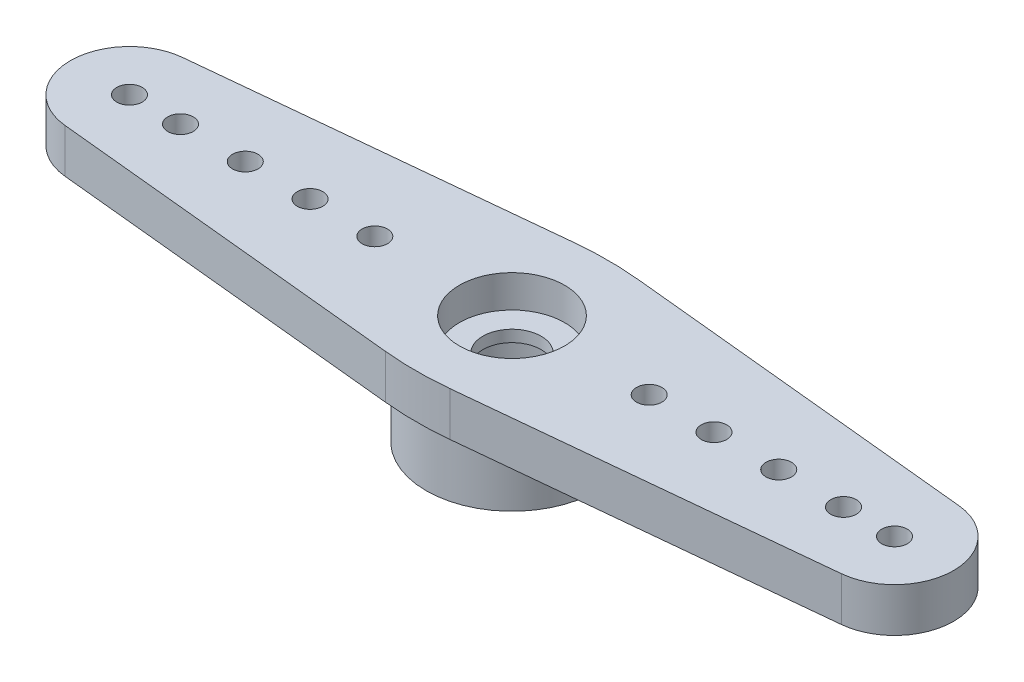
ISO-10303-21;
HEADER;
FILE_DESCRIPTION(('STEP AP214'),'2;1');
FILE_NAME('part.step','',(''),(''),'','','');
FILE_SCHEMA(('AUTOMOTIVE_DESIGN { 1 0 10303 214 1 1 1 1 }'));
ENDSEC;
DATA;
#1=APPLICATION_CONTEXT('core data for automotive mechanical design processes');
#2=APPLICATION_PROTOCOL_DEFINITION('international standard','automotive_design',2000,#1);
#3=PRODUCT_CONTEXT('',#1,'mechanical');
#4=PRODUCT('Part','Part','',(#3));
#5=PRODUCT_RELATED_PRODUCT_CATEGORY('part','',(#4));
#6=PRODUCT_DEFINITION_FORMATION('','',#4);
#7=PRODUCT_DEFINITION_CONTEXT('part definition',#1,'design');
#8=PRODUCT_DEFINITION('design','',#6,#7);
#9=PRODUCT_DEFINITION_SHAPE('','',#8);
#10=(LENGTH_UNIT() NAMED_UNIT(*) SI_UNIT(.MILLI.,.METRE.));
#11=(NAMED_UNIT(*) PLANE_ANGLE_UNIT() SI_UNIT($,.RADIAN.));
#12=(NAMED_UNIT(*) SI_UNIT($,.STERADIAN.) SOLID_ANGLE_UNIT());
#13=UNCERTAINTY_MEASURE_WITH_UNIT(LENGTH_MEASURE(1.E-05),#10,'distance_accuracy_value','');
#14=(GEOMETRIC_REPRESENTATION_CONTEXT(3) GLOBAL_UNCERTAINTY_ASSIGNED_CONTEXT((#13)) GLOBAL_UNIT_ASSIGNED_CONTEXT((#10,
#11,#12)) REPRESENTATION_CONTEXT('',''));
#15=CARTESIAN_POINT('',(0.,0.,0.));
#16=DIRECTION('',(0.,0.,1.));
#17=DIRECTION('',(1.,0.,0.));
#18=AXIS2_PLACEMENT_3D('',#15,#16,#17);
#19=CARTESIAN_POINT('',(0.,4.2672,0.));
#20=DIRECTION('',(0.,-1.,0.));
#21=DIRECTION('',(0.,0.,-1.));
#22=AXIS2_PLACEMENT_3D('',#19,#20,#21);
#23=CYLINDRICAL_SURFACE('',#22,1.143);
#24=CARTESIAN_POINT('',(0.,2.54,0.));
#25=DIRECTION('',(0.,1.,0.));
#26=DIRECTION('',(0.,0.,1.));
#27=AXIS2_PLACEMENT_3D('',#24,#25,#26);
#28=CIRCLE('',#27,1.143);
#29=CARTESIAN_POINT('',(0.,2.54,1.143));
#30=VERTEX_POINT('',#29);
#31=EDGE_CURVE('E124',#30,#30,#28,.T.);
#32=ORIENTED_EDGE('',*,*,#31,.F.);
#33=EDGE_LOOP('',(#32));
#34=FACE_BOUND('',#33,.T.);
#35=CARTESIAN_POINT('',(0.,2.9972,0.));
#36=DIRECTION('',(0.,1.,0.));
#37=DIRECTION('',(0.,0.,1.));
#38=AXIS2_PLACEMENT_3D('',#35,#36,#37);
#39=CIRCLE('',#38,1.143);
#40=CARTESIAN_POINT('',(0.,2.9972,1.143));
#41=VERTEX_POINT('',#40);
#42=EDGE_CURVE('E464',#41,#41,#39,.F.);
#43=ORIENTED_EDGE('',*,*,#42,.F.);
#44=EDGE_LOOP('',(#43));
#45=FACE_BOUND('',#44,.T.);
#46=ADVANCED_FACE('F35',(#34,#45),#23,.F.);
#47=CARTESIAN_POINT('',(0.,0.,0.));
#48=DIRECTION('',(0.,1.,0.));
#49=DIRECTION('',(0.,0.,1.));
#50=AXIS2_PLACEMENT_3D('',#47,#48,#49);
#51=PLANE('',#50);
#52=CARTESIAN_POINT('',(0.,0.,0.));
#53=DIRECTION('',(0.,1.,0.));
#54=DIRECTION('',(0.,0.,1.));
#55=AXIS2_PLACEMENT_3D('',#52,#53,#54);
#56=CIRCLE('',#55,3.3655);
#57=CARTESIAN_POINT('',(0.,0.,3.3655));
#58=VERTEX_POINT('',#57);
#59=EDGE_CURVE('E219',#58,#58,#56,.T.);
#60=ORIENTED_EDGE('',*,*,#59,.F.);
#61=EDGE_LOOP('',(#60));
#62=FACE_BOUND('',#61,.T.);
#63=CARTESIAN_POINT('',(0.,0.,0.));
#64=DIRECTION('',(0.,1.,0.));
#65=DIRECTION('',(0.,0.,1.));
#66=AXIS2_PLACEMENT_3D('',#63,#64,#65);
#67=CIRCLE('',#66,2.5);
#68=CARTESIAN_POINT('',(0.,0.,2.5));
#69=VERTEX_POINT('',#68);
#70=EDGE_CURVE('E216',#69,#69,#67,.T.);
#71=ORIENTED_EDGE('',*,*,#70,.T.);
#72=EDGE_LOOP('',(#71));
#73=FACE_BOUND('',#72,.T.);
#74=ADVANCED_FACE('F271',(#62,#73),#51,.F.);
#75=CARTESIAN_POINT('',(0.,2.54,0.));
#76=DIRECTION('',(0.,-1.,0.));
#77=DIRECTION('',(0.,0.,-1.));
#78=AXIS2_PLACEMENT_3D('',#75,#76,#77);
#79=CYLINDRICAL_SURFACE('',#78,3.3655);
#80=CARTESIAN_POINT('',(0.,2.54,0.));
#81=DIRECTION('',(0.,1.,0.));
#82=DIRECTION('',(0.,0.,1.));
#83=AXIS2_PLACEMENT_3D('',#80,#81,#82);
#84=CIRCLE('',#83,3.3655);
#85=CARTESIAN_POINT('',(0.,2.54,3.3655));
#86=VERTEX_POINT('',#85);
#87=EDGE_CURVE('E220',#86,#86,#84,.T.);
#88=ORIENTED_EDGE('',*,*,#87,.F.);
#89=EDGE_LOOP('',(#88));
#90=FACE_BOUND('',#89,.T.);
#91=ORIENTED_EDGE('',*,*,#59,.T.);
#92=EDGE_LOOP('',(#91));
#93=FACE_BOUND('',#92,.T.);
#94=ADVANCED_FACE('F277',(#90,#93),#79,.T.);
#95=CARTESIAN_POINT('',(0.,2.54,0.));
#96=DIRECTION('',(0.,-1.,0.));
#97=DIRECTION('',(0.,0.,-1.));
#98=AXIS2_PLACEMENT_3D('',#95,#96,#97);
#99=CYLINDRICAL_SURFACE('',#98,2.5);
#100=CARTESIAN_POINT('',(0.,2.54,0.));
#101=DIRECTION('',(0.,1.,0.));
#102=DIRECTION('',(0.,0.,1.));
#103=AXIS2_PLACEMENT_3D('',#100,#101,#102);
#104=CIRCLE('',#103,2.5);
#105=CARTESIAN_POINT('',(0.,2.54,2.5));
#106=VERTEX_POINT('',#105);
#107=EDGE_CURVE('E112',#106,#106,#104,.T.);
#108=ORIENTED_EDGE('',*,*,#107,.T.);
#109=EDGE_LOOP('',(#108));
#110=FACE_BOUND('',#109,.T.);
#111=ORIENTED_EDGE('',*,*,#70,.F.);
#112=EDGE_LOOP('',(#111));
#113=FACE_BOUND('',#112,.T.);
#114=ADVANCED_FACE('F339',(#110,#113),#99,.F.);
#115=CARTESIAN_POINT('',(0.,2.54,0.));
#116=DIRECTION('',(0.,1.,0.));
#117=DIRECTION('',(0.,0.,1.));
#118=AXIS2_PLACEMENT_3D('',#115,#116,#117);
#119=PLANE('',#118);
#120=ORIENTED_EDGE('',*,*,#31,.T.);
#121=EDGE_LOOP('',(#120));
#122=FACE_BOUND('',#121,.T.);
#123=ORIENTED_EDGE('',*,*,#107,.F.);
#124=EDGE_LOOP('',(#123));
#125=FACE_BOUND('',#124,.T.);
#126=ADVANCED_FACE('F335',(#122,#125),#119,.F.);
#127=CARTESIAN_POINT('',(-15.,4.2672,0.));
#128=DIRECTION('',(0.,-1.,0.));
#129=DIRECTION('',(0.,0.,-1.));
#130=AXIS2_PLACEMENT_3D('',#127,#128,#129);
#131=CYLINDRICAL_SURFACE('',#130,2.31775);
#132=CARTESIAN_POINT('',(-15.,2.54,0.));
#133=DIRECTION('',(0.,1.,0.));
#134=DIRECTION('',(0.,0.,1.));
#135=AXIS2_PLACEMENT_3D('',#132,#133,#134);
#136=CIRCLE('',#135,2.31775);
#137=CARTESIAN_POINT('',(-15.2296336726967,2.54,2.30634633974688));
#138=VERTEX_POINT('',#137);
#139=CARTESIAN_POINT('',(-15.2296336726967,2.54,-2.30634633974688));
#140=VERTEX_POINT('',#139);
#141=EDGE_CURVE('E111',#138,#140,#136,.F.);
#142=ORIENTED_EDGE('',*,*,#141,.F.);
#143=DIRECTION('',(0.,-1.,0.));
#144=VECTOR('',#143,1.);
#145=CARTESIAN_POINT('',(-15.2296336726967,4.2672,2.30634633974688));
#146=LINE('',#145,#144);
#147=CARTESIAN_POINT('',(-15.2296336726967,4.2672,2.30634633974688));
#148=VERTEX_POINT('',#147);
#149=EDGE_CURVE('E100',#148,#138,#146,.T.);
#150=ORIENTED_EDGE('',*,*,#149,.F.);
#151=CARTESIAN_POINT('',(-15.,4.2672,0.));
#152=DIRECTION('',(0.,1.,0.));
#153=DIRECTION('',(0.,0.,1.));
#154=AXIS2_PLACEMENT_3D('',#151,#152,#153);
#155=CIRCLE('',#154,2.31775);
#156=CARTESIAN_POINT('',(-15.2296336726967,4.2672,-2.30634633974688));
#157=VERTEX_POINT('',#156);
#158=EDGE_CURVE('E104',#148,#157,#155,.F.);
#159=ORIENTED_EDGE('',*,*,#158,.T.);
#160=DIRECTION('',(0.,-1.,0.));
#161=VECTOR('',#160,1.);
#162=CARTESIAN_POINT('',(-15.2296336726967,4.2672,-2.30634633974688));
#163=LINE('',#162,#161);
#164=EDGE_CURVE('E162',#157,#140,#163,.T.);
#165=ORIENTED_EDGE('',*,*,#164,.T.);
#166=EDGE_LOOP('',(#142,#150,#159,#165));
#167=FACE_BOUND('',#166,.T.);
#168=ADVANCED_FACE('F108',(#167),#131,.T.);
#169=CARTESIAN_POINT('',(-0.376874830325234,4.2672,3.78517608178222));
#170=DIRECTION('',(-0.0990761180872368,0.,0.995079857511328));
#171=DIRECTION('',(0.995079857511328,0.,0.0990761180872368));
#172=AXIS2_PLACEMENT_3D('',#169,#170,#171);
#173=PLANE('',#172);
#174=DIRECTION('',(-0.995079857511328,0.,-0.0990761180872368));
#175=VECTOR('',#174,1.);
#176=CARTESIAN_POINT('',(-0.376874830325234,2.54,3.78517608178222));
#177=LINE('',#176,#175);
#178=CARTESIAN_POINT('',(-1.25826669970791,2.54,3.6974194215776));
#179=VERTEX_POINT('',#178);
#180=EDGE_CURVE('E168',#179,#138,#177,.T.);
#181=ORIENTED_EDGE('',*,*,#180,.F.);
#182=DIRECTION('',(0.,-1.,0.));
#183=VECTOR('',#182,1.);
#184=CARTESIAN_POINT('',(-1.25826669970791,4.2672,3.6974194215776));
#185=LINE('',#184,#183);
#186=CARTESIAN_POINT('',(-1.25826669970791,4.2672,3.6974194215776));
#187=VERTEX_POINT('',#186);
#188=EDGE_CURVE('E11',#179,#187,#185,.F.);
#189=ORIENTED_EDGE('',*,*,#188,.T.);
#190=DIRECTION('',(-0.995079857511328,0.,-0.0990761180872368));
#191=VECTOR('',#190,1.);
#192=CARTESIAN_POINT('',(-0.376874830325234,4.2672,3.78517608178222));
#193=LINE('',#192,#191);
#194=EDGE_CURVE('E97',#187,#148,#193,.T.);
#195=ORIENTED_EDGE('',*,*,#194,.T.);
#196=ORIENTED_EDGE('',*,*,#149,.T.);
#197=EDGE_LOOP('',(#181,#189,#195,#196));
#198=FACE_BOUND('',#197,.T.);
#199=ADVANCED_FACE('F99',(#198),#173,.T.);
#200=CARTESIAN_POINT('',(0.376874830325234,4.2672,3.78517608178222));
#201=DIRECTION('',(-0.0990761180872368,0.,-0.995079857511328));
#202=DIRECTION('',(-0.995079857511328,0.,0.0990761180872368));
#203=AXIS2_PLACEMENT_3D('',#200,#201,#202);
#204=PLANE('',#203);
#205=DIRECTION('',(0.995079857511328,0.,-0.0990761180872368));
#206=VECTOR('',#205,1.);
#207=CARTESIAN_POINT('',(0.376874830325234,4.2672,3.78517608178222));
#208=LINE('',#207,#206);
#209=CARTESIAN_POINT('',(1.25826669970791,4.2672,3.6974194215776));
#210=VERTEX_POINT('',#209);
#211=CARTESIAN_POINT('',(15.2296336726967,4.2672,2.30634633974688));
#212=VERTEX_POINT('',#211);
#213=EDGE_CURVE('E103',#210,#212,#208,.T.);
#214=ORIENTED_EDGE('',*,*,#213,.F.);
#215=DIRECTION('',(0.,-1.,0.));
#216=VECTOR('',#215,1.);
#217=CARTESIAN_POINT('',(1.25826669970791,2.54,3.6974194215776));
#218=LINE('',#217,#216);
#219=CARTESIAN_POINT('',(1.25826669970791,2.54,3.6974194215776));
#220=VERTEX_POINT('',#219);
#221=EDGE_CURVE('E43',#210,#220,#218,.T.);
#222=ORIENTED_EDGE('',*,*,#221,.T.);
#223=DIRECTION('',(0.995079857511328,0.,-0.0990761180872368));
#224=VECTOR('',#223,1.);
#225=CARTESIAN_POINT('',(0.376874830325234,2.54,3.78517608178222));
#226=LINE('',#225,#224);
#227=CARTESIAN_POINT('',(15.2296336726967,2.54,2.30634633974688));
#228=VERTEX_POINT('',#227);
#229=EDGE_CURVE('E170',#220,#228,#226,.T.);
#230=ORIENTED_EDGE('',*,*,#229,.T.);
#231=DIRECTION('',(0.,-1.,0.));
#232=VECTOR('',#231,1.);
#233=CARTESIAN_POINT('',(15.2296336726967,4.2672,2.30634633974688));
#234=LINE('',#233,#232);
#235=EDGE_CURVE('E113',#212,#228,#234,.T.);
#236=ORIENTED_EDGE('',*,*,#235,.F.);
#237=EDGE_LOOP('',(#214,#222,#230,#236));
#238=FACE_BOUND('',#237,.T.);
#239=ADVANCED_FACE('F240',(#238),#204,.F.);
#240=CARTESIAN_POINT('',(15.,4.2672,0.));
#241=DIRECTION('',(0.,-1.,0.));
#242=DIRECTION('',(0.,0.,-1.));
#243=AXIS2_PLACEMENT_3D('',#240,#241,#242);
#244=CYLINDRICAL_SURFACE('',#243,2.31775);
#245=CARTESIAN_POINT('',(15.,2.54,0.));
#246=DIRECTION('',(0.,1.,0.));
#247=DIRECTION('',(0.,0.,1.));
#248=AXIS2_PLACEMENT_3D('',#245,#246,#247);
#249=CIRCLE('',#248,2.31775);
#250=CARTESIAN_POINT('',(15.2296336726967,2.54,-2.30634633974688));
#251=VERTEX_POINT('',#250);
#252=EDGE_CURVE('E172',#228,#251,#249,.T.);
#253=ORIENTED_EDGE('',*,*,#252,.T.);
#254=DIRECTION('',(0.,-1.,0.));
#255=VECTOR('',#254,1.);
#256=CARTESIAN_POINT('',(15.2296336726967,4.2672,-2.30634633974688));
#257=LINE('',#256,#255);
#258=CARTESIAN_POINT('',(15.2296336726967,4.2672,-2.30634633974688));
#259=VERTEX_POINT('',#258);
#260=EDGE_CURVE('E209',#259,#251,#257,.T.);
#261=ORIENTED_EDGE('',*,*,#260,.F.);
#262=CARTESIAN_POINT('',(15.,4.2672,0.));
#263=DIRECTION('',(0.,1.,0.));
#264=DIRECTION('',(0.,0.,1.));
#265=AXIS2_PLACEMENT_3D('',#262,#263,#264);
#266=CIRCLE('',#265,2.31775);
#267=EDGE_CURVE('E129',#212,#259,#266,.T.);
#268=ORIENTED_EDGE('',*,*,#267,.F.);
#269=ORIENTED_EDGE('',*,*,#235,.T.);
#270=EDGE_LOOP('',(#253,#261,#268,#269));
#271=FACE_BOUND('',#270,.T.);
#272=ADVANCED_FACE('F252',(#271),#244,.T.);
#273=CARTESIAN_POINT('',(0.376874830325234,4.2672,-3.78517608178222));
#274=DIRECTION('',(0.0990761180872368,0.,-0.995079857511328));
#275=DIRECTION('',(-0.995079857511328,0.,-0.0990761180872368));
#276=AXIS2_PLACEMENT_3D('',#273,#274,#275);
#277=PLANE('',#276);
#278=DIRECTION('',(0.995079857511328,0.,0.0990761180872368));
#279=VECTOR('',#278,1.);
#280=CARTESIAN_POINT('',(0.376874830325234,2.54,-3.78517608178222));
#281=LINE('',#280,#279);
#282=CARTESIAN_POINT('',(1.25826669970791,2.54,-3.6974194215776));
#283=VERTEX_POINT('',#282);
#284=EDGE_CURVE('E175',#283,#251,#281,.T.);
#285=ORIENTED_EDGE('',*,*,#284,.F.);
#286=DIRECTION('',(0.,-1.,0.));
#287=VECTOR('',#286,1.);
#288=CARTESIAN_POINT('',(1.25826669970791,4.2672,-3.6974194215776));
#289=LINE('',#288,#287);
#290=CARTESIAN_POINT('',(1.25826669970791,4.2672,-3.6974194215776));
#291=VERTEX_POINT('',#290);
#292=EDGE_CURVE('E232',#283,#291,#289,.F.);
#293=ORIENTED_EDGE('',*,*,#292,.T.);
#294=DIRECTION('',(0.995079857511328,0.,0.0990761180872368));
#295=VECTOR('',#294,1.);
#296=CARTESIAN_POINT('',(0.376874830325234,4.2672,-3.78517608178222));
#297=LINE('',#296,#295);
#298=EDGE_CURVE('E132',#291,#259,#297,.T.);
#299=ORIENTED_EDGE('',*,*,#298,.T.);
#300=ORIENTED_EDGE('',*,*,#260,.T.);
#301=EDGE_LOOP('',(#285,#293,#299,#300));
#302=FACE_BOUND('',#301,.T.);
#303=ADVANCED_FACE('F289',(#302),#277,.T.);
#304=CARTESIAN_POINT('',(15.,4.2672,0.));
#305=DIRECTION('',(0.,-1.,0.));
#306=DIRECTION('',(0.,0.,-1.));
#307=AXIS2_PLACEMENT_3D('',#304,#305,#306);
#308=CYLINDRICAL_SURFACE('',#307,0.500000000000001);
#309=CARTESIAN_POINT('',(15.,4.2672,0.));
#310=DIRECTION('',(0.,1.,0.));
#311=DIRECTION('',(0.,0.,1.));
#312=AXIS2_PLACEMENT_3D('',#309,#310,#311);
#313=CIRCLE('',#312,0.500000000000001);
#314=CARTESIAN_POINT('',(15.,4.2672,0.500000000000001));
#315=VERTEX_POINT('',#314);
#316=EDGE_CURVE('E159',#315,#315,#313,.T.);
#317=ORIENTED_EDGE('',*,*,#316,.T.);
#318=EDGE_LOOP('',(#317));
#319=FACE_BOUND('',#318,.T.);
#320=CARTESIAN_POINT('',(15.,2.54,0.));
#321=DIRECTION('',(0.,1.,0.));
#322=DIRECTION('',(0.,0.,1.));
#323=AXIS2_PLACEMENT_3D('',#320,#321,#322);
#324=CIRCLE('',#323,0.500000000000001);
#325=CARTESIAN_POINT('',(15.,2.54,0.500000000000001));
#326=VERTEX_POINT('',#325);
#327=EDGE_CURVE('E203',#326,#326,#324,.T.);
#328=ORIENTED_EDGE('',*,*,#327,.F.);
#329=EDGE_LOOP('',(#328));
#330=FACE_BOUND('',#329,.T.);
#331=ADVANCED_FACE('F285',(#319,#330),#308,.F.);
#332=CARTESIAN_POINT('',(5.38,4.2672,0.));
#333=DIRECTION('',(0.,-1.,0.));
#334=DIRECTION('',(0.,0.,-1.));
#335=AXIS2_PLACEMENT_3D('',#332,#333,#334);
#336=CYLINDRICAL_SURFACE('',#335,0.500000000000001);
#337=CARTESIAN_POINT('',(5.38,4.2672,0.));
#338=DIRECTION('',(0.,1.,0.));
#339=DIRECTION('',(0.,0.,1.));
#340=AXIS2_PLACEMENT_3D('',#337,#338,#339);
#341=CIRCLE('',#340,0.500000000000001);
#342=CARTESIAN_POINT('',(5.38,4.2672,0.500000000000001));
#343=VERTEX_POINT('',#342);
#344=EDGE_CURVE('E156',#343,#343,#341,.T.);
#345=ORIENTED_EDGE('',*,*,#344,.T.);
#346=EDGE_LOOP('',(#345));
#347=FACE_BOUND('',#346,.T.);
#348=CARTESIAN_POINT('',(5.38,2.54,0.));
#349=DIRECTION('',(0.,1.,0.));
#350=DIRECTION('',(0.,0.,1.));
#351=AXIS2_PLACEMENT_3D('',#348,#349,#350);
#352=CIRCLE('',#351,0.500000000000001);
#353=CARTESIAN_POINT('',(5.38,2.54,0.500000000000001));
#354=VERTEX_POINT('',#353);
#355=EDGE_CURVE('E200',#354,#354,#352,.T.);
#356=ORIENTED_EDGE('',*,*,#355,.F.);
#357=EDGE_LOOP('',(#356));
#358=FACE_BOUND('',#357,.T.);
#359=ADVANCED_FACE('F288',(#347,#358),#336,.F.);
#360=CARTESIAN_POINT('',(7.92,4.2672,0.));
#361=DIRECTION('',(0.,-1.,0.));
#362=DIRECTION('',(0.,0.,-1.));
#363=AXIS2_PLACEMENT_3D('',#360,#361,#362);
#364=CYLINDRICAL_SURFACE('',#363,0.500000000000002);
#365=CARTESIAN_POINT('',(7.92,4.2672,0.));
#366=DIRECTION('',(0.,1.,0.));
#367=DIRECTION('',(0.,0.,1.));
#368=AXIS2_PLACEMENT_3D('',#365,#366,#367);
#369=CIRCLE('',#368,0.500000000000002);
#370=CARTESIAN_POINT('',(7.92,4.2672,0.500000000000002));
#371=VERTEX_POINT('',#370);
#372=EDGE_CURVE('E153',#371,#371,#369,.T.);
#373=ORIENTED_EDGE('',*,*,#372,.T.);
#374=EDGE_LOOP('',(#373));
#375=FACE_BOUND('',#374,.T.);
#376=CARTESIAN_POINT('',(7.92,2.54,0.));
#377=DIRECTION('',(0.,1.,0.));
#378=DIRECTION('',(0.,0.,1.));
#379=AXIS2_PLACEMENT_3D('',#376,#377,#378);
#380=CIRCLE('',#379,0.500000000000002);
#381=CARTESIAN_POINT('',(7.92,2.54,0.500000000000002));
#382=VERTEX_POINT('',#381);
#383=EDGE_CURVE('E197',#382,#382,#380,.T.);
#384=ORIENTED_EDGE('',*,*,#383,.F.);
#385=EDGE_LOOP('',(#384));
#386=FACE_BOUND('',#385,.T.);
#387=ADVANCED_FACE('F293',(#375,#386),#364,.F.);
#388=CARTESIAN_POINT('',(10.46,4.2672,0.));
#389=DIRECTION('',(0.,-1.,0.));
#390=DIRECTION('',(0.,0.,-1.));
#391=AXIS2_PLACEMENT_3D('',#388,#389,#390);
#392=CYLINDRICAL_SURFACE('',#391,0.500000000000001);
#393=CARTESIAN_POINT('',(10.46,4.2672,0.));
#394=DIRECTION('',(0.,1.,0.));
#395=DIRECTION('',(0.,0.,1.));
#396=AXIS2_PLACEMENT_3D('',#393,#394,#395);
#397=CIRCLE('',#396,0.500000000000001);
#398=CARTESIAN_POINT('',(10.46,4.2672,0.500000000000001));
#399=VERTEX_POINT('',#398);
#400=EDGE_CURVE('E150',#399,#399,#397,.T.);
#401=ORIENTED_EDGE('',*,*,#400,.T.);
#402=EDGE_LOOP('',(#401));
#403=FACE_BOUND('',#402,.T.);
#404=CARTESIAN_POINT('',(10.46,2.54,0.));
#405=DIRECTION('',(0.,1.,0.));
#406=DIRECTION('',(0.,0.,1.));
#407=AXIS2_PLACEMENT_3D('',#404,#405,#406);
#408=CIRCLE('',#407,0.500000000000001);
#409=CARTESIAN_POINT('',(10.46,2.54,0.500000000000001));
#410=VERTEX_POINT('',#409);
#411=EDGE_CURVE('E194',#410,#410,#408,.T.);
#412=ORIENTED_EDGE('',*,*,#411,.F.);
#413=EDGE_LOOP('',(#412));
#414=FACE_BOUND('',#413,.T.);
#415=ADVANCED_FACE('F297',(#403,#414),#392,.F.);
#416=CARTESIAN_POINT('',(13.,4.2672,0.));
#417=DIRECTION('',(0.,-1.,0.));
#418=DIRECTION('',(0.,0.,-1.));
#419=AXIS2_PLACEMENT_3D('',#416,#417,#418);
#420=CYLINDRICAL_SURFACE('',#419,0.500000000000001);
#421=CARTESIAN_POINT('',(13.,4.2672,0.));
#422=DIRECTION('',(0.,1.,0.));
#423=DIRECTION('',(0.,0.,1.));
#424=AXIS2_PLACEMENT_3D('',#421,#422,#423);
#425=CIRCLE('',#424,0.500000000000001);
#426=CARTESIAN_POINT('',(13.,4.2672,0.500000000000001));
#427=VERTEX_POINT('',#426);
#428=EDGE_CURVE('E147',#427,#427,#425,.T.);
#429=ORIENTED_EDGE('',*,*,#428,.T.);
#430=EDGE_LOOP('',(#429));
#431=FACE_BOUND('',#430,.T.);
#432=CARTESIAN_POINT('',(13.,2.54,0.));
#433=DIRECTION('',(0.,1.,0.));
#434=DIRECTION('',(0.,0.,1.));
#435=AXIS2_PLACEMENT_3D('',#432,#433,#434);
#436=CIRCLE('',#435,0.500000000000001);
#437=CARTESIAN_POINT('',(13.,2.54,0.500000000000001));
#438=VERTEX_POINT('',#437);
#439=EDGE_CURVE('E191',#438,#438,#436,.T.);
#440=ORIENTED_EDGE('',*,*,#439,.F.);
#441=EDGE_LOOP('',(#440));
#442=FACE_BOUND('',#441,.T.);
#443=ADVANCED_FACE('F301',(#431,#442),#420,.F.);
#444=CARTESIAN_POINT('',(-15.,4.2672,0.));
#445=DIRECTION('',(0.,-1.,0.));
#446=DIRECTION('',(0.,0.,-1.));
#447=AXIS2_PLACEMENT_3D('',#444,#445,#446);
#448=CYLINDRICAL_SURFACE('',#447,0.500000000000001);
#449=CARTESIAN_POINT('',(-15.,4.2672,0.));
#450=DIRECTION('',(0.,1.,0.));
#451=DIRECTION('',(0.,0.,1.));
#452=AXIS2_PLACEMENT_3D('',#449,#450,#451);
#453=CIRCLE('',#452,0.500000000000001);
#454=CARTESIAN_POINT('',(-15.,4.2672,0.500000000000001));
#455=VERTEX_POINT('',#454);
#456=EDGE_CURVE('E144',#455,#455,#453,.F.);
#457=ORIENTED_EDGE('',*,*,#456,.F.);
#458=EDGE_LOOP('',(#457));
#459=FACE_BOUND('',#458,.T.);
#460=CARTESIAN_POINT('',(-15.,2.54,0.));
#461=DIRECTION('',(0.,1.,0.));
#462=DIRECTION('',(0.,0.,1.));
#463=AXIS2_PLACEMENT_3D('',#460,#461,#462);
#464=CIRCLE('',#463,0.500000000000001);
#465=CARTESIAN_POINT('',(-15.,2.54,0.500000000000001));
#466=VERTEX_POINT('',#465);
#467=EDGE_CURVE('E188',#466,#466,#464,.F.);
#468=ORIENTED_EDGE('',*,*,#467,.T.);
#469=EDGE_LOOP('',(#468));
#470=FACE_BOUND('',#469,.T.);
#471=ADVANCED_FACE('F305',(#459,#470),#448,.F.);
#472=CARTESIAN_POINT('',(-5.38,4.2672,0.));
#473=DIRECTION('',(0.,-1.,0.));
#474=DIRECTION('',(0.,0.,-1.));
#475=AXIS2_PLACEMENT_3D('',#472,#473,#474);
#476=CYLINDRICAL_SURFACE('',#475,0.500000000000001);
#477=CARTESIAN_POINT('',(-5.38,4.2672,0.));
#478=DIRECTION('',(0.,1.,0.));
#479=DIRECTION('',(0.,0.,1.));
#480=AXIS2_PLACEMENT_3D('',#477,#478,#479);
#481=CIRCLE('',#480,0.500000000000001);
#482=CARTESIAN_POINT('',(-5.38,4.2672,0.500000000000001));
#483=VERTEX_POINT('',#482);
#484=EDGE_CURVE('E141',#483,#483,#481,.F.);
#485=ORIENTED_EDGE('',*,*,#484,.F.);
#486=EDGE_LOOP('',(#485));
#487=FACE_BOUND('',#486,.T.);
#488=CARTESIAN_POINT('',(-5.38,2.54,0.));
#489=DIRECTION('',(0.,1.,0.));
#490=DIRECTION('',(0.,0.,1.));
#491=AXIS2_PLACEMENT_3D('',#488,#489,#490);
#492=CIRCLE('',#491,0.500000000000001);
#493=CARTESIAN_POINT('',(-5.38,2.54,0.500000000000001));
#494=VERTEX_POINT('',#493);
#495=EDGE_CURVE('E185',#494,#494,#492,.F.);
#496=ORIENTED_EDGE('',*,*,#495,.T.);
#497=EDGE_LOOP('',(#496));
#498=FACE_BOUND('',#497,.T.);
#499=ADVANCED_FACE('F309',(#487,#498),#476,.F.);
#500=CARTESIAN_POINT('',(-10.46,4.2672,0.));
#501=DIRECTION('',(0.,-1.,0.));
#502=DIRECTION('',(0.,0.,-1.));
#503=AXIS2_PLACEMENT_3D('',#500,#501,#502);
#504=CYLINDRICAL_SURFACE('',#503,0.500000000000001);
#505=CARTESIAN_POINT('',(-10.46,4.2672,0.));
#506=DIRECTION('',(0.,1.,0.));
#507=DIRECTION('',(0.,0.,1.));
#508=AXIS2_PLACEMENT_3D('',#505,#506,#507);
#509=CIRCLE('',#508,0.500000000000001);
#510=CARTESIAN_POINT('',(-10.46,4.2672,0.500000000000001));
#511=VERTEX_POINT('',#510);
#512=EDGE_CURVE('E138',#511,#511,#509,.F.);
#513=ORIENTED_EDGE('',*,*,#512,.F.);
#514=EDGE_LOOP('',(#513));
#515=FACE_BOUND('',#514,.T.);
#516=CARTESIAN_POINT('',(-10.46,2.54,0.));
#517=DIRECTION('',(0.,1.,0.));
#518=DIRECTION('',(0.,0.,1.));
#519=AXIS2_PLACEMENT_3D('',#516,#517,#518);
#520=CIRCLE('',#519,0.500000000000001);
#521=CARTESIAN_POINT('',(-10.46,2.54,0.500000000000001));
#522=VERTEX_POINT('',#521);
#523=EDGE_CURVE('E182',#522,#522,#520,.F.);
#524=ORIENTED_EDGE('',*,*,#523,.T.);
#525=EDGE_LOOP('',(#524));
#526=FACE_BOUND('',#525,.T.);
#527=ADVANCED_FACE('F313',(#515,#526),#504,.F.);
#528=CARTESIAN_POINT('',(-7.92,4.2672,0.));
#529=DIRECTION('',(0.,-1.,0.));
#530=DIRECTION('',(0.,0.,-1.));
#531=AXIS2_PLACEMENT_3D('',#528,#529,#530);
#532=CYLINDRICAL_SURFACE('',#531,0.500000000000002);
#533=CARTESIAN_POINT('',(-7.92,4.2672,0.));
#534=DIRECTION('',(0.,1.,0.));
#535=DIRECTION('',(0.,0.,1.));
#536=AXIS2_PLACEMENT_3D('',#533,#534,#535);
#537=CIRCLE('',#536,0.500000000000002);
#538=CARTESIAN_POINT('',(-7.92,4.2672,0.500000000000002));
#539=VERTEX_POINT('',#538);
#540=EDGE_CURVE('E135',#539,#539,#537,.F.);
#541=ORIENTED_EDGE('',*,*,#540,.F.);
#542=EDGE_LOOP('',(#541));
#543=FACE_BOUND('',#542,.T.);
#544=CARTESIAN_POINT('',(-7.92,2.54,0.));
#545=DIRECTION('',(0.,1.,0.));
#546=DIRECTION('',(0.,0.,1.));
#547=AXIS2_PLACEMENT_3D('',#544,#545,#546);
#548=CIRCLE('',#547,0.500000000000002);
#549=CARTESIAN_POINT('',(-7.92,2.54,0.500000000000002));
#550=VERTEX_POINT('',#549);
#551=EDGE_CURVE('E179',#550,#550,#548,.F.);
#552=ORIENTED_EDGE('',*,*,#551,.T.);
#553=EDGE_LOOP('',(#552));
#554=FACE_BOUND('',#553,.T.);
#555=ADVANCED_FACE('F317',(#543,#554),#532,.F.);
#556=CARTESIAN_POINT('',(-0.376874830325234,4.2672,-3.78517608178222));
#557=DIRECTION('',(0.0990761180872368,0.,0.995079857511328));
#558=DIRECTION('',(0.995079857511328,0.,-0.0990761180872368));
#559=AXIS2_PLACEMENT_3D('',#556,#557,#558);
#560=PLANE('',#559);
#561=DIRECTION('',(-0.995079857511328,0.,0.0990761180872368));
#562=VECTOR('',#561,1.);
#563=CARTESIAN_POINT('',(-0.376874830325234,4.2672,-3.78517608178222));
#564=LINE('',#563,#562);
#565=CARTESIAN_POINT('',(-1.25826669970791,4.2672,-3.6974194215776));
#566=VERTEX_POINT('',#565);
#567=EDGE_CURVE('E119',#566,#157,#564,.T.);
#568=ORIENTED_EDGE('',*,*,#567,.F.);
#569=DIRECTION('',(0.,-1.,0.));
#570=VECTOR('',#569,1.);
#571=CARTESIAN_POINT('',(-1.25826669970791,2.54,-3.6974194215776));
#572=LINE('',#571,#570);
#573=CARTESIAN_POINT('',(-1.25826669970791,2.54,-3.6974194215776));
#574=VERTEX_POINT('',#573);
#575=EDGE_CURVE('E223',#566,#574,#572,.T.);
#576=ORIENTED_EDGE('',*,*,#575,.T.);
#577=DIRECTION('',(-0.995079857511328,0.,0.0990761180872368));
#578=VECTOR('',#577,1.);
#579=CARTESIAN_POINT('',(-0.376874830325234,2.54,-3.78517608178222));
#580=LINE('',#579,#578);
#581=EDGE_CURVE('E177',#574,#140,#580,.T.);
#582=ORIENTED_EDGE('',*,*,#581,.T.);
#583=ORIENTED_EDGE('',*,*,#164,.F.);
#584=EDGE_LOOP('',(#568,#576,#582,#583));
#585=FACE_BOUND('',#584,.T.);
#586=ADVANCED_FACE('F260',(#585),#560,.F.);
#587=CARTESIAN_POINT('',(-13.,4.2672,0.));
#588=DIRECTION('',(0.,-1.,0.));
#589=DIRECTION('',(0.,0.,-1.));
#590=AXIS2_PLACEMENT_3D('',#587,#588,#589);
#591=CYLINDRICAL_SURFACE('',#590,0.500000000000001);
#592=CARTESIAN_POINT('',(-13.,4.2672,0.));
#593=DIRECTION('',(0.,1.,0.));
#594=DIRECTION('',(0.,0.,1.));
#595=AXIS2_PLACEMENT_3D('',#592,#593,#594);
#596=CIRCLE('',#595,0.500000000000001);
#597=CARTESIAN_POINT('',(-13.,4.2672,0.500000000000001));
#598=VERTEX_POINT('',#597);
#599=EDGE_CURVE('E121',#598,#598,#596,.F.);
#600=ORIENTED_EDGE('',*,*,#599,.F.);
#601=EDGE_LOOP('',(#600));
#602=FACE_BOUND('',#601,.T.);
#603=CARTESIAN_POINT('',(-13.,2.54,0.));
#604=DIRECTION('',(0.,1.,0.));
#605=DIRECTION('',(0.,0.,1.));
#606=AXIS2_PLACEMENT_3D('',#603,#604,#605);
#607=CIRCLE('',#606,0.500000000000001);
#608=CARTESIAN_POINT('',(-13.,2.54,0.500000000000001));
#609=VERTEX_POINT('',#608);
#610=EDGE_CURVE('E163',#609,#609,#607,.F.);
#611=ORIENTED_EDGE('',*,*,#610,.T.);
#612=EDGE_LOOP('',(#611));
#613=FACE_BOUND('',#612,.T.);
#614=ADVANCED_FACE('F324',(#602,#613),#591,.F.);
#615=CARTESIAN_POINT('',(0.,4.2672,0.));
#616=DIRECTION('',(0.,1.,0.));
#617=DIRECTION('',(0.,0.,1.));
#618=AXIS2_PLACEMENT_3D('',#615,#616,#617);
#619=PLANE('',#618);
#620=CARTESIAN_POINT('',(0.,4.2672,0.));
#621=DIRECTION('',(0.,1.,0.));
#622=DIRECTION('',(0.,0.,1.));
#623=AXIS2_PLACEMENT_3D('',#620,#621,#622);
#624=CIRCLE('',#623,2.06375);
#625=CARTESIAN_POINT('',(0.,4.2672,2.06375));
#626=VERTEX_POINT('',#625);
#627=EDGE_CURVE('E468',#626,#626,#624,.T.);
#628=ORIENTED_EDGE('',*,*,#627,.F.);
#629=EDGE_LOOP('',(#628));
#630=FACE_BOUND('',#629,.T.);
#631=ORIENTED_EDGE('',*,*,#599,.T.);
#632=EDGE_LOOP('',(#631));
#633=FACE_BOUND('',#632,.T.);
#634=ORIENTED_EDGE('',*,*,#298,.F.);
#635=CARTESIAN_POINT('',(0.,4.2672,8.94009476881626));
#636=DIRECTION('',(0.,1.,0.));
#637=DIRECTION('',(0.,0.,1.));
#638=AXIS2_PLACEMENT_3D('',#635,#636,#637);
#639=CIRCLE('',#638,12.7);
#640=EDGE_CURVE('E235',#291,#566,#639,.T.);
#641=ORIENTED_EDGE('',*,*,#640,.T.);
#642=ORIENTED_EDGE('',*,*,#567,.T.);
#643=ORIENTED_EDGE('',*,*,#158,.F.);
#644=ORIENTED_EDGE('',*,*,#194,.F.);
#645=CARTESIAN_POINT('',(0.,4.2672,-8.94009476881626));
#646=DIRECTION('',(0.,1.,0.));
#647=DIRECTION('',(0.,0.,1.));
#648=AXIS2_PLACEMENT_3D('',#645,#646,#647);
#649=CIRCLE('',#648,12.7);
#650=EDGE_CURVE('E50',#187,#210,#649,.T.);
#651=ORIENTED_EDGE('',*,*,#650,.T.);
#652=ORIENTED_EDGE('',*,*,#213,.T.);
#653=ORIENTED_EDGE('',*,*,#267,.T.);
#654=EDGE_LOOP('',(#634,#641,#642,#643,#644,#651,#652,#653));
#655=FACE_BOUND('',#654,.T.);
#656=ORIENTED_EDGE('',*,*,#540,.T.);
#657=EDGE_LOOP('',(#656));
#658=FACE_BOUND('',#657,.T.);
#659=ORIENTED_EDGE('',*,*,#512,.T.);
#660=EDGE_LOOP('',(#659));
#661=FACE_BOUND('',#660,.T.);
#662=ORIENTED_EDGE('',*,*,#484,.T.);
#663=EDGE_LOOP('',(#662));
#664=FACE_BOUND('',#663,.T.);
#665=ORIENTED_EDGE('',*,*,#456,.T.);
#666=EDGE_LOOP('',(#665));
#667=FACE_BOUND('',#666,.T.);
#668=ORIENTED_EDGE('',*,*,#428,.F.);
#669=EDGE_LOOP('',(#668));
#670=FACE_BOUND('',#669,.T.);
#671=ORIENTED_EDGE('',*,*,#400,.F.);
#672=EDGE_LOOP('',(#671));
#673=FACE_BOUND('',#672,.T.);
#674=ORIENTED_EDGE('',*,*,#372,.F.);
#675=EDGE_LOOP('',(#674));
#676=FACE_BOUND('',#675,.T.);
#677=ORIENTED_EDGE('',*,*,#344,.F.);
#678=EDGE_LOOP('',(#677));
#679=FACE_BOUND('',#678,.T.);
#680=ORIENTED_EDGE('',*,*,#316,.F.);
#681=EDGE_LOOP('',(#680));
#682=FACE_BOUND('',#681,.T.);
#683=ADVANCED_FACE('F116',(#630,#633,#655,#658,#661,#664,#667,#670,#673,#676,#679,#682),#619,.T.);
#684=ORIENTED_EDGE('',*,*,#87,.T.);
#685=EDGE_LOOP('',(#684));
#686=FACE_BOUND('',#685,.T.);
#687=ORIENTED_EDGE('',*,*,#610,.F.);
#688=EDGE_LOOP('',(#687));
#689=FACE_BOUND('',#688,.T.);
#690=ORIENTED_EDGE('',*,*,#581,.F.);
#691=CARTESIAN_POINT('',(0.,2.54,8.94009476881626));
#692=DIRECTION('',(0.,1.,0.));
#693=DIRECTION('',(0.,0.,1.));
#694=AXIS2_PLACEMENT_3D('',#691,#692,#693);
#695=CIRCLE('',#694,12.7);
#696=EDGE_CURVE('E230',#574,#283,#695,.F.);
#697=ORIENTED_EDGE('',*,*,#696,.T.);
#698=ORIENTED_EDGE('',*,*,#284,.T.);
#699=ORIENTED_EDGE('',*,*,#252,.F.);
#700=ORIENTED_EDGE('',*,*,#229,.F.);
#701=CARTESIAN_POINT('',(0.,2.54,-8.94009476881626));
#702=DIRECTION('',(0.,1.,0.));
#703=DIRECTION('',(0.,0.,1.));
#704=AXIS2_PLACEMENT_3D('',#701,#702,#703);
#705=CIRCLE('',#704,12.7);
#706=EDGE_CURVE('E228',#220,#179,#705,.F.);
#707=ORIENTED_EDGE('',*,*,#706,.T.);
#708=ORIENTED_EDGE('',*,*,#180,.T.);
#709=ORIENTED_EDGE('',*,*,#141,.T.);
#710=EDGE_LOOP('',(#690,#697,#698,#699,#700,#707,#708,#709));
#711=FACE_BOUND('',#710,.T.);
#712=ORIENTED_EDGE('',*,*,#551,.F.);
#713=EDGE_LOOP('',(#712));
#714=FACE_BOUND('',#713,.T.);
#715=ORIENTED_EDGE('',*,*,#523,.F.);
#716=EDGE_LOOP('',(#715));
#717=FACE_BOUND('',#716,.T.);
#718=ORIENTED_EDGE('',*,*,#495,.F.);
#719=EDGE_LOOP('',(#718));
#720=FACE_BOUND('',#719,.T.);
#721=ORIENTED_EDGE('',*,*,#467,.F.);
#722=EDGE_LOOP('',(#721));
#723=FACE_BOUND('',#722,.T.);
#724=ORIENTED_EDGE('',*,*,#439,.T.);
#725=EDGE_LOOP('',(#724));
#726=FACE_BOUND('',#725,.T.);
#727=ORIENTED_EDGE('',*,*,#411,.T.);
#728=EDGE_LOOP('',(#727));
#729=FACE_BOUND('',#728,.T.);
#730=ORIENTED_EDGE('',*,*,#383,.T.);
#731=EDGE_LOOP('',(#730));
#732=FACE_BOUND('',#731,.T.);
#733=ORIENTED_EDGE('',*,*,#355,.T.);
#734=EDGE_LOOP('',(#733));
#735=FACE_BOUND('',#734,.T.);
#736=ORIENTED_EDGE('',*,*,#327,.T.);
#737=EDGE_LOOP('',(#736));
#738=FACE_BOUND('',#737,.T.);
#739=ADVANCED_FACE('F246',(#686,#689,#711,#714,#717,#720,#723,#726,#729,#732,#735,#738),#119,.F.);
#740=CARTESIAN_POINT('',(0.,4.2672,8.94009476881626));
#741=DIRECTION('',(0.,1.,0.));
#742=DIRECTION('',(0.,0.,1.));
#743=AXIS2_PLACEMENT_3D('',#740,#741,#742);
#744=CYLINDRICAL_SURFACE('',#743,12.7);
#745=ORIENTED_EDGE('',*,*,#640,.F.);
#746=ORIENTED_EDGE('',*,*,#292,.F.);
#747=ORIENTED_EDGE('',*,*,#696,.F.);
#748=ORIENTED_EDGE('',*,*,#575,.F.);
#749=EDGE_LOOP('',(#745,#746,#747,#748));
#750=FACE_BOUND('',#749,.T.);
#751=ADVANCED_FACE('F258',(#750),#744,.T.);
#752=CARTESIAN_POINT('',(0.,4.2672,-8.94009476881626));
#753=DIRECTION('',(0.,1.,0.));
#754=DIRECTION('',(0.,0.,1.));
#755=AXIS2_PLACEMENT_3D('',#752,#753,#754);
#756=CYLINDRICAL_SURFACE('',#755,12.7);
#757=ORIENTED_EDGE('',*,*,#650,.F.);
#758=ORIENTED_EDGE('',*,*,#188,.F.);
#759=ORIENTED_EDGE('',*,*,#706,.F.);
#760=ORIENTED_EDGE('',*,*,#221,.F.);
#761=EDGE_LOOP('',(#757,#758,#759,#760));
#762=FACE_BOUND('',#761,.T.);
#763=ADVANCED_FACE('F37',(#762),#756,.T.);
#764=CARTESIAN_POINT('',(0.,2.9972,0.));
#765=DIRECTION('',(0.,1.,0.));
#766=DIRECTION('',(0.,0.,1.));
#767=AXIS2_PLACEMENT_3D('',#764,#765,#766);
#768=CYLINDRICAL_SURFACE('',#767,2.06375);
#769=CARTESIAN_POINT('',(0.,2.9972,0.));
#770=DIRECTION('',(0.,1.,0.));
#771=DIRECTION('',(0.,0.,1.));
#772=AXIS2_PLACEMENT_3D('',#769,#770,#771);
#773=CIRCLE('',#772,2.06375);
#774=CARTESIAN_POINT('',(0.,2.9972,2.06375));
#775=VERTEX_POINT('',#774);
#776=EDGE_CURVE('E166',#775,#775,#773,.T.);
#777=ORIENTED_EDGE('',*,*,#776,.F.);
#778=EDGE_LOOP('',(#777));
#779=FACE_BOUND('',#778,.T.);
#780=ORIENTED_EDGE('',*,*,#627,.T.);
#781=EDGE_LOOP('',(#780));
#782=FACE_BOUND('',#781,.T.);
#783=ADVANCED_FACE('F262',(#779,#782),#768,.F.);
#784=CARTESIAN_POINT('',(0.,2.9972,0.));
#785=DIRECTION('',(0.,1.,0.));
#786=DIRECTION('',(0.,0.,1.));
#787=AXIS2_PLACEMENT_3D('',#784,#785,#786);
#788=PLANE('',#787);
#789=ORIENTED_EDGE('',*,*,#42,.T.);
#790=EDGE_LOOP('',(#789));
#791=FACE_BOUND('',#790,.T.);
#792=ORIENTED_EDGE('',*,*,#776,.T.);
#793=EDGE_LOOP('',(#792));
#794=FACE_BOUND('',#793,.T.);
#795=ADVANCED_FACE('F267',(#791,#794),#788,.T.);
#796=CLOSED_SHELL('',(#46,#74,#94,#114,#126,#168,#199,#239,#272,#303,#331,#359,#387,#415,#443,
#471,#499,#527,#555,#586,#614,#683,#739,#751,#763,#783,#795));
#797=MANIFOLD_SOLID_BREP('B2',#796);
#798=ADVANCED_BREP_SHAPE_REPRESENTATION('',(#18,#797),#14);
#799=SHAPE_DEFINITION_REPRESENTATION(#9,#798);
ENDSEC;
END-ISO-10303-21;
